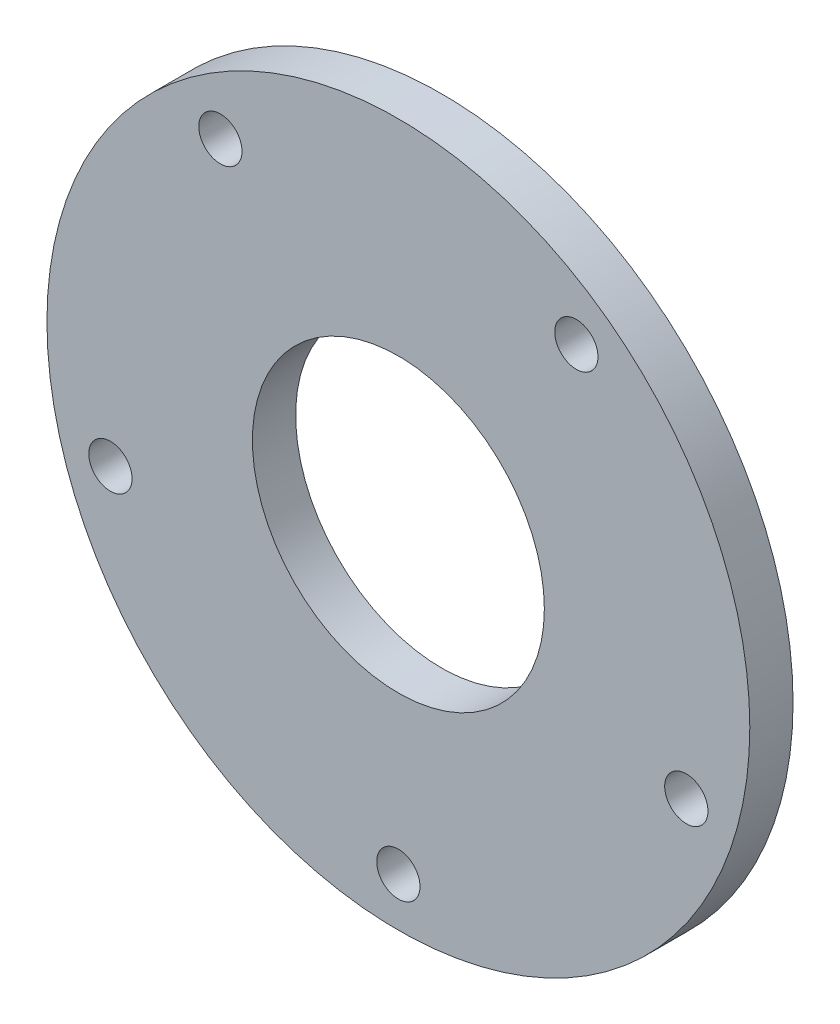
ISO-10303-21;
HEADER;
FILE_DESCRIPTION(('STEP AP214'),'2;1');
FILE_NAME('part.step','',(''),(''),'','','');
FILE_SCHEMA(('AUTOMOTIVE_DESIGN { 1 0 10303 214 1 1 1 1 }'));
ENDSEC;
DATA;
#1=APPLICATION_CONTEXT('core data for automotive mechanical design processes');
#2=APPLICATION_PROTOCOL_DEFINITION('international standard','automotive_design',2000,#1);
#3=PRODUCT_CONTEXT('',#1,'mechanical');
#4=PRODUCT('Part','Part','',(#3));
#5=PRODUCT_RELATED_PRODUCT_CATEGORY('part','',(#4));
#6=PRODUCT_DEFINITION_FORMATION('','',#4);
#7=PRODUCT_DEFINITION_CONTEXT('part definition',#1,'design');
#8=PRODUCT_DEFINITION('design','',#6,#7);
#9=PRODUCT_DEFINITION_SHAPE('','',#8);
#10=(LENGTH_UNIT() NAMED_UNIT(*) SI_UNIT(.MILLI.,.METRE.));
#11=(NAMED_UNIT(*) PLANE_ANGLE_UNIT() SI_UNIT($,.RADIAN.));
#12=(NAMED_UNIT(*) SI_UNIT($,.STERADIAN.) SOLID_ANGLE_UNIT());
#13=UNCERTAINTY_MEASURE_WITH_UNIT(LENGTH_MEASURE(1.E-05),#10,'distance_accuracy_value','');
#14=(GEOMETRIC_REPRESENTATION_CONTEXT(3) GLOBAL_UNCERTAINTY_ASSIGNED_CONTEXT((#13)) GLOBAL_UNIT_ASSIGNED_CONTEXT((#10,
#11,#12)) REPRESENTATION_CONTEXT('',''));
#15=CARTESIAN_POINT('',(0.,0.,0.));
#16=DIRECTION('',(0.,0.,1.));
#17=DIRECTION('',(1.,0.,0.));
#18=AXIS2_PLACEMENT_3D('',#15,#16,#17);
#19=CARTESIAN_POINT('',(0.,0.,4.));
#20=DIRECTION('',(0.,0.,1.));
#21=DIRECTION('',(1.,0.,0.));
#22=AXIS2_PLACEMENT_3D('',#19,#20,#21);
#23=PLANE('',#22);
#24=CARTESIAN_POINT('',(16.4579870641894,22.6524758424984,4.));
#25=DIRECTION('',(0.,0.,1.));
#26=DIRECTION('',(1.,0.,0.));
#27=AXIS2_PLACEMENT_3D('',#24,#25,#26);
#28=CIRCLE('',#27,2.);
#29=CARTESIAN_POINT('',(18.4579870641894,22.6524758424984,4.));
#30=VERTEX_POINT('',#29);
#31=EDGE_CURVE('E80',#30,#30,#28,.T.);
#32=ORIENTED_EDGE('',*,*,#31,.F.);
#33=EDGE_LOOP('',(#32));
#34=FACE_BOUND('',#33,.T.);
#35=CARTESIAN_POINT('',(-26.6295824562643,-8.65247584249844,4.));
#36=DIRECTION('',(0.,0.,1.));
#37=DIRECTION('',(1.,0.,0.));
#38=AXIS2_PLACEMENT_3D('',#35,#36,#37);
#39=CIRCLE('',#38,2.);
#40=CARTESIAN_POINT('',(-24.6295824562643,-8.65247584249844,4.));
#41=VERTEX_POINT('',#40);
#42=EDGE_CURVE('E64',#41,#41,#39,.T.);
#43=ORIENTED_EDGE('',*,*,#42,.F.);
#44=EDGE_LOOP('',(#43));
#45=FACE_BOUND('',#44,.T.);
#46=CARTESIAN_POINT('',(0.,0.,4.));
#47=DIRECTION('',(0.,0.,1.));
#48=DIRECTION('',(1.,0.,0.));
#49=AXIS2_PLACEMENT_3D('',#46,#47,#48);
#50=CIRCLE('',#49,13.5);
#51=CARTESIAN_POINT('',(13.5,0.,4.));
#52=VERTEX_POINT('',#51);
#53=EDGE_CURVE('E50',#52,#52,#50,.T.);
#54=ORIENTED_EDGE('',*,*,#53,.F.);
#55=EDGE_LOOP('',(#54));
#56=FACE_BOUND('',#55,.T.);
#57=CARTESIAN_POINT('',(0.,0.,4.));
#58=DIRECTION('',(0.,0.,1.));
#59=DIRECTION('',(1.,0.,0.));
#60=AXIS2_PLACEMENT_3D('',#57,#58,#59);
#61=CIRCLE('',#60,32.5);
#62=CARTESIAN_POINT('',(32.5,0.,4.));
#63=VERTEX_POINT('',#62);
#64=EDGE_CURVE('E10',#63,#63,#61,.T.);
#65=ORIENTED_EDGE('',*,*,#64,.T.);
#66=EDGE_LOOP('',(#65));
#67=FACE_BOUND('',#66,.T.);
#68=CARTESIAN_POINT('',(0.,-28.,4.));
#69=DIRECTION('',(0.,0.,1.));
#70=DIRECTION('',(1.,0.,0.));
#71=AXIS2_PLACEMENT_3D('',#68,#69,#70);
#72=CIRCLE('',#71,2.);
#73=CARTESIAN_POINT('',(2.,-28.,4.));
#74=VERTEX_POINT('',#73);
#75=EDGE_CURVE('E56',#74,#74,#72,.T.);
#76=ORIENTED_EDGE('',*,*,#75,.F.);
#77=EDGE_LOOP('',(#76));
#78=FACE_BOUND('',#77,.T.);
#79=CARTESIAN_POINT('',(-16.4579870641891,22.6524758424986,4.));
#80=DIRECTION('',(0.,0.,1.));
#81=DIRECTION('',(1.,0.,0.));
#82=AXIS2_PLACEMENT_3D('',#79,#80,#81);
#83=CIRCLE('',#82,2.);
#84=CARTESIAN_POINT('',(-14.4579870641891,22.6524758424986,4.));
#85=VERTEX_POINT('',#84);
#86=EDGE_CURVE('E72',#85,#85,#83,.T.);
#87=ORIENTED_EDGE('',*,*,#86,.F.);
#88=EDGE_LOOP('',(#87));
#89=FACE_BOUND('',#88,.T.);
#90=CARTESIAN_POINT('',(26.6295824562642,-8.65247584249883,4.));
#91=DIRECTION('',(0.,0.,1.));
#92=DIRECTION('',(1.,0.,0.));
#93=AXIS2_PLACEMENT_3D('',#90,#91,#92);
#94=CIRCLE('',#93,2.);
#95=CARTESIAN_POINT('',(28.6295824562642,-8.65247584249883,4.));
#96=VERTEX_POINT('',#95);
#97=EDGE_CURVE('E88',#96,#96,#94,.T.);
#98=ORIENTED_EDGE('',*,*,#97,.F.);
#99=EDGE_LOOP('',(#98));
#100=FACE_BOUND('',#99,.T.);
#101=ADVANCED_FACE('F37',(#34,#45,#56,#67,#78,#89,#100),#23,.T.);
#102=CARTESIAN_POINT('',(0.,0.,0.));
#103=DIRECTION('',(0.,0.,1.));
#104=DIRECTION('',(1.,0.,0.));
#105=AXIS2_PLACEMENT_3D('',#102,#103,#104);
#106=PLANE('',#105);
#107=CARTESIAN_POINT('',(0.,0.,0.));
#108=DIRECTION('',(0.,0.,1.));
#109=DIRECTION('',(1.,0.,0.));
#110=AXIS2_PLACEMENT_3D('',#107,#108,#109);
#111=CIRCLE('',#110,32.5);
#112=CARTESIAN_POINT('',(32.5,0.,0.));
#113=VERTEX_POINT('',#112);
#114=EDGE_CURVE('E41',#113,#113,#111,.T.);
#115=ORIENTED_EDGE('',*,*,#114,.F.);
#116=EDGE_LOOP('',(#115));
#117=FACE_BOUND('',#116,.T.);
#118=CARTESIAN_POINT('',(0.,0.,0.));
#119=DIRECTION('',(0.,0.,1.));
#120=DIRECTION('',(1.,0.,0.));
#121=AXIS2_PLACEMENT_3D('',#118,#119,#120);
#122=CIRCLE('',#121,13.5);
#123=CARTESIAN_POINT('',(13.5,0.,0.));
#124=VERTEX_POINT('',#123);
#125=EDGE_CURVE('E52',#124,#124,#122,.T.);
#126=ORIENTED_EDGE('',*,*,#125,.T.);
#127=EDGE_LOOP('',(#126));
#128=FACE_BOUND('',#127,.T.);
#129=CARTESIAN_POINT('',(0.,-28.,0.));
#130=DIRECTION('',(0.,0.,1.));
#131=DIRECTION('',(1.,0.,0.));
#132=AXIS2_PLACEMENT_3D('',#129,#130,#131);
#133=CIRCLE('',#132,2.);
#134=CARTESIAN_POINT('',(2.,-28.,0.));
#135=VERTEX_POINT('',#134);
#136=EDGE_CURVE('E60',#135,#135,#133,.T.);
#137=ORIENTED_EDGE('',*,*,#136,.T.);
#138=EDGE_LOOP('',(#137));
#139=FACE_BOUND('',#138,.T.);
#140=CARTESIAN_POINT('',(-26.6295824562643,-8.65247584249844,0.));
#141=DIRECTION('',(0.,0.,1.));
#142=DIRECTION('',(1.,0.,0.));
#143=AXIS2_PLACEMENT_3D('',#140,#141,#142);
#144=CIRCLE('',#143,2.);
#145=CARTESIAN_POINT('',(-24.6295824562643,-8.65247584249844,0.));
#146=VERTEX_POINT('',#145);
#147=EDGE_CURVE('E68',#146,#146,#144,.T.);
#148=ORIENTED_EDGE('',*,*,#147,.T.);
#149=EDGE_LOOP('',(#148));
#150=FACE_BOUND('',#149,.T.);
#151=CARTESIAN_POINT('',(-16.4579870641891,22.6524758424986,0.));
#152=DIRECTION('',(0.,0.,1.));
#153=DIRECTION('',(1.,0.,0.));
#154=AXIS2_PLACEMENT_3D('',#151,#152,#153);
#155=CIRCLE('',#154,2.);
#156=CARTESIAN_POINT('',(-14.4579870641891,22.6524758424986,0.));
#157=VERTEX_POINT('',#156);
#158=EDGE_CURVE('E76',#157,#157,#155,.T.);
#159=ORIENTED_EDGE('',*,*,#158,.T.);
#160=EDGE_LOOP('',(#159));
#161=FACE_BOUND('',#160,.T.);
#162=CARTESIAN_POINT('',(16.4579870641894,22.6524758424984,0.));
#163=DIRECTION('',(0.,0.,1.));
#164=DIRECTION('',(1.,0.,0.));
#165=AXIS2_PLACEMENT_3D('',#162,#163,#164);
#166=CIRCLE('',#165,2.);
#167=CARTESIAN_POINT('',(18.4579870641894,22.6524758424984,0.));
#168=VERTEX_POINT('',#167);
#169=EDGE_CURVE('E84',#168,#168,#166,.T.);
#170=ORIENTED_EDGE('',*,*,#169,.T.);
#171=EDGE_LOOP('',(#170));
#172=FACE_BOUND('',#171,.T.);
#173=CARTESIAN_POINT('',(26.6295824562642,-8.65247584249883,0.));
#174=DIRECTION('',(0.,0.,1.));
#175=DIRECTION('',(1.,0.,0.));
#176=AXIS2_PLACEMENT_3D('',#173,#174,#175);
#177=CIRCLE('',#176,2.);
#178=CARTESIAN_POINT('',(28.6295824562642,-8.65247584249883,0.));
#179=VERTEX_POINT('',#178);
#180=EDGE_CURVE('E92',#179,#179,#177,.T.);
#181=ORIENTED_EDGE('',*,*,#180,.T.);
#182=EDGE_LOOP('',(#181));
#183=FACE_BOUND('',#182,.T.);
#184=ADVANCED_FACE('F104',(#117,#128,#139,#150,#161,#172,#183),#106,.F.);
#185=CARTESIAN_POINT('',(0.,0.,4.));
#186=DIRECTION('',(0.,0.,-1.));
#187=DIRECTION('',(-1.,0.,0.));
#188=AXIS2_PLACEMENT_3D('',#185,#186,#187);
#189=CYLINDRICAL_SURFACE('',#188,32.5);
#190=ORIENTED_EDGE('',*,*,#64,.F.);
#191=EDGE_LOOP('',(#190));
#192=FACE_BOUND('',#191,.T.);
#193=ORIENTED_EDGE('',*,*,#114,.T.);
#194=EDGE_LOOP('',(#193));
#195=FACE_BOUND('',#194,.T.);
#196=ADVANCED_FACE('F39',(#192,#195),#189,.T.);
#197=CARTESIAN_POINT('',(0.,0.,4.));
#198=DIRECTION('',(0.,0.,-1.));
#199=DIRECTION('',(-1.,0.,0.));
#200=AXIS2_PLACEMENT_3D('',#197,#198,#199);
#201=CYLINDRICAL_SURFACE('',#200,13.5);
#202=ORIENTED_EDGE('',*,*,#53,.T.);
#203=EDGE_LOOP('',(#202));
#204=FACE_BOUND('',#203,.T.);
#205=ORIENTED_EDGE('',*,*,#125,.F.);
#206=EDGE_LOOP('',(#205));
#207=FACE_BOUND('',#206,.T.);
#208=ADVANCED_FACE('F114',(#204,#207),#201,.F.);
#209=CARTESIAN_POINT('',(0.,-28.,4.));
#210=DIRECTION('',(0.,0.,-1.));
#211=DIRECTION('',(-1.,0.,0.));
#212=AXIS2_PLACEMENT_3D('',#209,#210,#211);
#213=CYLINDRICAL_SURFACE('',#212,2.);
#214=ORIENTED_EDGE('',*,*,#75,.T.);
#215=EDGE_LOOP('',(#214));
#216=FACE_BOUND('',#215,.T.);
#217=ORIENTED_EDGE('',*,*,#136,.F.);
#218=EDGE_LOOP('',(#217));
#219=FACE_BOUND('',#218,.T.);
#220=ADVANCED_FACE('F117',(#216,#219),#213,.F.);
#221=CARTESIAN_POINT('',(-26.6295824562643,-8.65247584249844,4.));
#222=DIRECTION('',(0.,0.,-1.));
#223=DIRECTION('',(-1.,0.,0.));
#224=AXIS2_PLACEMENT_3D('',#221,#222,#223);
#225=CYLINDRICAL_SURFACE('',#224,2.);
#226=ORIENTED_EDGE('',*,*,#42,.T.);
#227=EDGE_LOOP('',(#226));
#228=FACE_BOUND('',#227,.T.);
#229=ORIENTED_EDGE('',*,*,#147,.F.);
#230=EDGE_LOOP('',(#229));
#231=FACE_BOUND('',#230,.T.);
#232=ADVANCED_FACE('F121',(#228,#231),#225,.F.);
#233=CARTESIAN_POINT('',(-16.4579870641891,22.6524758424986,4.));
#234=DIRECTION('',(0.,0.,-1.));
#235=DIRECTION('',(-1.,0.,0.));
#236=AXIS2_PLACEMENT_3D('',#233,#234,#235);
#237=CYLINDRICAL_SURFACE('',#236,2.);
#238=ORIENTED_EDGE('',*,*,#86,.T.);
#239=EDGE_LOOP('',(#238));
#240=FACE_BOUND('',#239,.T.);
#241=ORIENTED_EDGE('',*,*,#158,.F.);
#242=EDGE_LOOP('',(#241));
#243=FACE_BOUND('',#242,.T.);
#244=ADVANCED_FACE('F125',(#240,#243),#237,.F.);
#245=CARTESIAN_POINT('',(16.4579870641894,22.6524758424984,4.));
#246=DIRECTION('',(0.,0.,-1.));
#247=DIRECTION('',(-1.,0.,0.));
#248=AXIS2_PLACEMENT_3D('',#245,#246,#247);
#249=CYLINDRICAL_SURFACE('',#248,2.);
#250=ORIENTED_EDGE('',*,*,#31,.T.);
#251=EDGE_LOOP('',(#250));
#252=FACE_BOUND('',#251,.T.);
#253=ORIENTED_EDGE('',*,*,#169,.F.);
#254=EDGE_LOOP('',(#253));
#255=FACE_BOUND('',#254,.T.);
#256=ADVANCED_FACE('F129',(#252,#255),#249,.F.);
#257=CARTESIAN_POINT('',(26.6295824562642,-8.65247584249883,4.));
#258=DIRECTION('',(0.,0.,-1.));
#259=DIRECTION('',(-1.,0.,0.));
#260=AXIS2_PLACEMENT_3D('',#257,#258,#259);
#261=CYLINDRICAL_SURFACE('',#260,2.);
#262=ORIENTED_EDGE('',*,*,#97,.T.);
#263=EDGE_LOOP('',(#262));
#264=FACE_BOUND('',#263,.T.);
#265=ORIENTED_EDGE('',*,*,#180,.F.);
#266=EDGE_LOOP('',(#265));
#267=FACE_BOUND('',#266,.T.);
#268=ADVANCED_FACE('F100',(#264,#267),#261,.F.);
#269=CLOSED_SHELL('',(#101,#184,#196,#208,#220,#232,#244,#256,#268));
#270=MANIFOLD_SOLID_BREP('B2',#269);
#271=ADVANCED_BREP_SHAPE_REPRESENTATION('',(#18,#270),#14);
#272=SHAPE_DEFINITION_REPRESENTATION(#9,#271);
ENDSEC;
END-ISO-10303-21;
